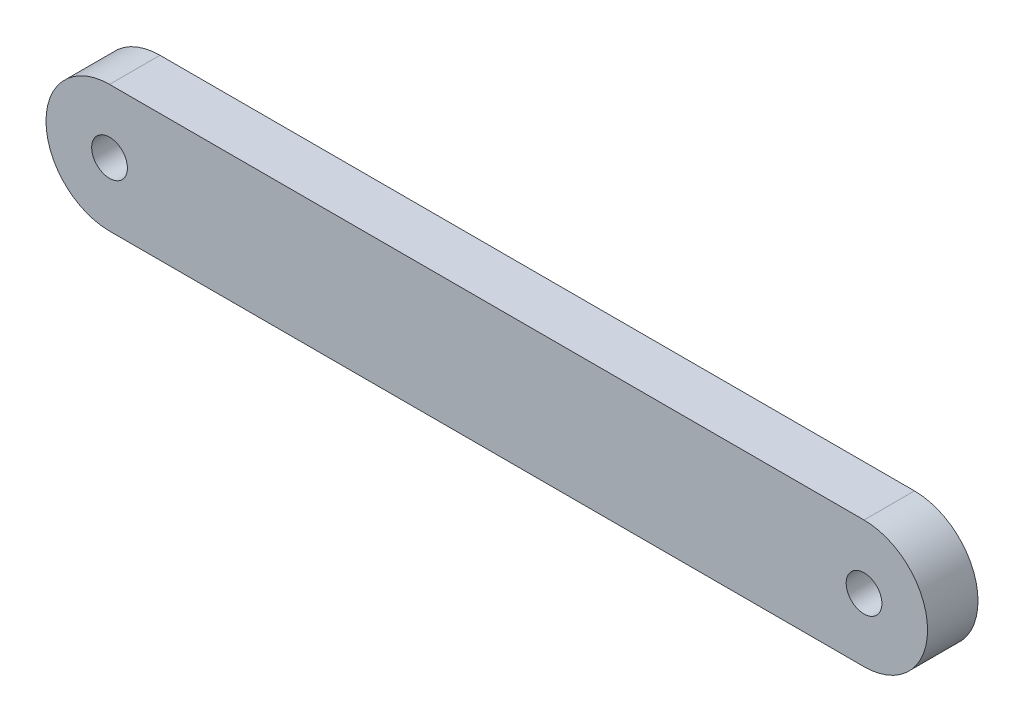
ISO-10303-21;
HEADER;
FILE_DESCRIPTION(('STEP AP214'),'2;1');
FILE_NAME('part.step','',(''),(''),'','','');
FILE_SCHEMA(('AUTOMOTIVE_DESIGN { 1 0 10303 214 1 1 1 1 }'));
ENDSEC;
DATA;
#1=APPLICATION_CONTEXT('core data for automotive mechanical design processes');
#2=APPLICATION_PROTOCOL_DEFINITION('international standard','automotive_design',2000,#1);
#3=PRODUCT_CONTEXT('',#1,'mechanical');
#4=PRODUCT('Part','Part','',(#3));
#5=PRODUCT_RELATED_PRODUCT_CATEGORY('part','',(#4));
#6=PRODUCT_DEFINITION_FORMATION('','',#4);
#7=PRODUCT_DEFINITION_CONTEXT('part definition',#1,'design');
#8=PRODUCT_DEFINITION('design','',#6,#7);
#9=PRODUCT_DEFINITION_SHAPE('','',#8);
#10=(LENGTH_UNIT() NAMED_UNIT(*) SI_UNIT(.MILLI.,.METRE.));
#11=(NAMED_UNIT(*) PLANE_ANGLE_UNIT() SI_UNIT($,.RADIAN.));
#12=(NAMED_UNIT(*) SI_UNIT($,.STERADIAN.) SOLID_ANGLE_UNIT());
#13=UNCERTAINTY_MEASURE_WITH_UNIT(LENGTH_MEASURE(1.E-05),#10,'distance_accuracy_value','');
#14=(GEOMETRIC_REPRESENTATION_CONTEXT(3) GLOBAL_UNCERTAINTY_ASSIGNED_CONTEXT((#13)) GLOBAL_UNIT_ASSIGNED_CONTEXT((#10,
#11,#12)) REPRESENTATION_CONTEXT('',''));
#15=CARTESIAN_POINT('',(0.,0.,0.));
#16=DIRECTION('',(0.,0.,1.));
#17=DIRECTION('',(1.,0.,0.));
#18=AXIS2_PLACEMENT_3D('',#15,#16,#17);
#19=CARTESIAN_POINT('',(47.5,0.,77.605));
#20=DIRECTION('',(0.,0.,-1.));
#21=DIRECTION('',(-1.,0.,0.));
#22=AXIS2_PLACEMENT_3D('',#19,#20,#21);
#23=PLANE('',#22);
#24=CARTESIAN_POINT('',(47.5,0.,77.605));
#25=DIRECTION('',(0.,0.,-1.));
#26=DIRECTION('',(-1.,0.,0.));
#27=AXIS2_PLACEMENT_3D('',#24,#25,#26);
#28=CIRCLE('',#27,2.25);
#29=CARTESIAN_POINT('',(45.25,0.,77.605));
#30=VERTEX_POINT('',#29);
#31=EDGE_CURVE('E100',#30,#30,#28,.T.);
#32=ORIENTED_EDGE('',*,*,#31,.F.);
#33=EDGE_LOOP('',(#32));
#34=FACE_BOUND('',#33,.T.);
#35=CARTESIAN_POINT('',(47.5,0.,77.605));
#36=DIRECTION('',(0.,0.,-1.));
#37=DIRECTION('',(-1.,0.,0.));
#38=AXIS2_PLACEMENT_3D('',#35,#36,#37);
#39=CIRCLE('',#38,8.);
#40=CARTESIAN_POINT('',(47.5,8.,77.605));
#41=VERTEX_POINT('',#40);
#42=CARTESIAN_POINT('',(47.5,-8.,77.605));
#43=VERTEX_POINT('',#42);
#44=EDGE_CURVE('E85',#41,#43,#39,.T.);
#45=ORIENTED_EDGE('',*,*,#44,.T.);
#46=DIRECTION('',(-1.,0.,0.));
#47=VECTOR('',#46,1.);
#48=CARTESIAN_POINT('',(47.5,-8.,77.605));
#49=LINE('',#48,#47);
#50=CARTESIAN_POINT('',(-47.5,-7.99999999999998,77.605));
#51=VERTEX_POINT('',#50);
#52=EDGE_CURVE('E80',#43,#51,#49,.T.);
#53=ORIENTED_EDGE('',*,*,#52,.T.);
#54=CARTESIAN_POINT('',(-47.5,0.,77.605));
#55=DIRECTION('',(0.,0.,-1.));
#56=DIRECTION('',(-1.,0.,0.));
#57=AXIS2_PLACEMENT_3D('',#54,#55,#56);
#58=CIRCLE('',#57,8.);
#59=CARTESIAN_POINT('',(-47.5,8.00000000000003,77.605));
#60=VERTEX_POINT('',#59);
#61=EDGE_CURVE('E83',#51,#60,#58,.T.);
#62=ORIENTED_EDGE('',*,*,#61,.T.);
#63=DIRECTION('',(1.,0.,0.));
#64=VECTOR('',#63,1.);
#65=CARTESIAN_POINT('',(47.5,8.,77.605));
#66=LINE('',#65,#64);
#67=EDGE_CURVE('E50',#60,#41,#66,.T.);
#68=ORIENTED_EDGE('',*,*,#67,.T.);
#69=EDGE_LOOP('',(#45,#53,#62,#68));
#70=FACE_BOUND('',#69,.T.);
#71=CARTESIAN_POINT('',(-47.5,0.,77.605));
#72=DIRECTION('',(0.,0.,-1.));
#73=DIRECTION('',(-1.,0.,0.));
#74=AXIS2_PLACEMENT_3D('',#71,#72,#73);
#75=CIRCLE('',#74,2.25);
#76=CARTESIAN_POINT('',(-49.75,0.,77.605));
#77=VERTEX_POINT('',#76);
#78=EDGE_CURVE('E115',#77,#77,#75,.T.);
#79=ORIENTED_EDGE('',*,*,#78,.F.);
#80=EDGE_LOOP('',(#79));
#81=FACE_BOUND('',#80,.T.);
#82=ADVANCED_FACE('F33',(#34,#70,#81),#23,.T.);
#83=CARTESIAN_POINT('',(47.5,0.,83.955));
#84=DIRECTION('',(0.,0.,-1.));
#85=DIRECTION('',(-1.,0.,0.));
#86=AXIS2_PLACEMENT_3D('',#83,#84,#85);
#87=PLANE('',#86);
#88=CARTESIAN_POINT('',(47.5,0.,83.955));
#89=DIRECTION('',(0.,0.,-1.));
#90=DIRECTION('',(-1.,0.,0.));
#91=AXIS2_PLACEMENT_3D('',#88,#89,#90);
#92=CIRCLE('',#91,8.);
#93=CARTESIAN_POINT('',(47.5,8.,83.955));
#94=VERTEX_POINT('',#93);
#95=CARTESIAN_POINT('',(47.5,-8.,83.955));
#96=VERTEX_POINT('',#95);
#97=EDGE_CURVE('E97',#94,#96,#92,.T.);
#98=ORIENTED_EDGE('',*,*,#97,.F.);
#99=DIRECTION('',(1.,0.,0.));
#100=VECTOR('',#99,1.);
#101=CARTESIAN_POINT('',(47.5,8.,83.955));
#102=LINE('',#101,#100);
#103=CARTESIAN_POINT('',(-47.5,8.00000000000003,83.955));
#104=VERTEX_POINT('',#103);
#105=EDGE_CURVE('E73',#104,#94,#102,.T.);
#106=ORIENTED_EDGE('',*,*,#105,.F.);
#107=CARTESIAN_POINT('',(-47.5,0.,83.955));
#108=DIRECTION('',(0.,0.,-1.));
#109=DIRECTION('',(-1.,0.,0.));
#110=AXIS2_PLACEMENT_3D('',#107,#108,#109);
#111=CIRCLE('',#110,8.);
#112=CARTESIAN_POINT('',(-47.5,-7.99999999999998,83.955));
#113=VERTEX_POINT('',#112);
#114=EDGE_CURVE('E67',#113,#104,#111,.T.);
#115=ORIENTED_EDGE('',*,*,#114,.F.);
#116=DIRECTION('',(-1.,0.,0.));
#117=VECTOR('',#116,1.);
#118=CARTESIAN_POINT('',(47.5,-8.,83.955));
#119=LINE('',#118,#117);
#120=EDGE_CURVE('E89',#96,#113,#119,.T.);
#121=ORIENTED_EDGE('',*,*,#120,.F.);
#122=EDGE_LOOP('',(#98,#106,#115,#121));
#123=FACE_BOUND('',#122,.T.);
#124=CARTESIAN_POINT('',(47.5,0.,83.955));
#125=DIRECTION('',(0.,0.,-1.));
#126=DIRECTION('',(-1.,0.,0.));
#127=AXIS2_PLACEMENT_3D('',#124,#125,#126);
#128=CIRCLE('',#127,2.25);
#129=CARTESIAN_POINT('',(45.25,0.,83.955));
#130=VERTEX_POINT('',#129);
#131=EDGE_CURVE('E112',#130,#130,#128,.T.);
#132=ORIENTED_EDGE('',*,*,#131,.T.);
#133=EDGE_LOOP('',(#132));
#134=FACE_BOUND('',#133,.T.);
#135=CARTESIAN_POINT('',(-47.5,0.,83.955));
#136=DIRECTION('',(0.,0.,-1.));
#137=DIRECTION('',(-1.,0.,0.));
#138=AXIS2_PLACEMENT_3D('',#135,#136,#137);
#139=CIRCLE('',#138,2.25);
#140=CARTESIAN_POINT('',(-49.75,0.,83.955));
#141=VERTEX_POINT('',#140);
#142=EDGE_CURVE('E118',#141,#141,#139,.T.);
#143=ORIENTED_EDGE('',*,*,#142,.T.);
#144=EDGE_LOOP('',(#143));
#145=FACE_BOUND('',#144,.T.);
#146=ADVANCED_FACE('F108',(#123,#134,#145),#87,.F.);
#147=CARTESIAN_POINT('',(47.5,0.,77.605));
#148=DIRECTION('',(0.,0.,1.));
#149=DIRECTION('',(1.,0.,0.));
#150=AXIS2_PLACEMENT_3D('',#147,#148,#149);
#151=CYLINDRICAL_SURFACE('',#150,8.);
#152=ORIENTED_EDGE('',*,*,#97,.T.);
#153=DIRECTION('',(0.,0.,1.));
#154=VECTOR('',#153,1.);
#155=CARTESIAN_POINT('',(47.5,-8.,77.605));
#156=LINE('',#155,#154);
#157=EDGE_CURVE('E11',#43,#96,#156,.T.);
#158=ORIENTED_EDGE('',*,*,#157,.F.);
#159=ORIENTED_EDGE('',*,*,#44,.F.);
#160=DIRECTION('',(0.,0.,1.));
#161=VECTOR('',#160,1.);
#162=CARTESIAN_POINT('',(47.5,8.,77.605));
#163=LINE('',#162,#161);
#164=EDGE_CURVE('E93',#41,#94,#163,.T.);
#165=ORIENTED_EDGE('',*,*,#164,.T.);
#166=EDGE_LOOP('',(#152,#158,#159,#165));
#167=FACE_BOUND('',#166,.T.);
#168=ADVANCED_FACE('F35',(#167),#151,.T.);
#169=CARTESIAN_POINT('',(47.5,-8.,77.605));
#170=DIRECTION('',(0.,1.,0.));
#171=DIRECTION('',(-1.,0.,0.));
#172=AXIS2_PLACEMENT_3D('',#169,#170,#171);
#173=PLANE('',#172);
#174=ORIENTED_EDGE('',*,*,#120,.T.);
#175=DIRECTION('',(0.,0.,1.));
#176=VECTOR('',#175,1.);
#177=CARTESIAN_POINT('',(-47.5,-7.99999999999998,77.605));
#178=LINE('',#177,#176);
#179=EDGE_CURVE('E42',#51,#113,#178,.T.);
#180=ORIENTED_EDGE('',*,*,#179,.F.);
#181=ORIENTED_EDGE('',*,*,#52,.F.);
#182=ORIENTED_EDGE('',*,*,#157,.T.);
#183=EDGE_LOOP('',(#174,#180,#181,#182));
#184=FACE_BOUND('',#183,.T.);
#185=ADVANCED_FACE('F88',(#184),#173,.F.);
#186=CARTESIAN_POINT('',(-47.5,0.,77.605));
#187=DIRECTION('',(0.,0.,1.));
#188=DIRECTION('',(1.,0.,0.));
#189=AXIS2_PLACEMENT_3D('',#186,#187,#188);
#190=CYLINDRICAL_SURFACE('',#189,8.);
#191=ORIENTED_EDGE('',*,*,#114,.T.);
#192=DIRECTION('',(0.,0.,1.));
#193=VECTOR('',#192,1.);
#194=CARTESIAN_POINT('',(-47.5,8.00000000000003,77.605));
#195=LINE('',#194,#193);
#196=EDGE_CURVE('E90',#60,#104,#195,.T.);
#197=ORIENTED_EDGE('',*,*,#196,.F.);
#198=ORIENTED_EDGE('',*,*,#61,.F.);
#199=ORIENTED_EDGE('',*,*,#179,.T.);
#200=EDGE_LOOP('',(#191,#197,#198,#199));
#201=FACE_BOUND('',#200,.T.);
#202=ADVANCED_FACE('F91',(#201),#190,.T.);
#203=CARTESIAN_POINT('',(47.5,8.,77.605));
#204=DIRECTION('',(0.,-1.,0.));
#205=DIRECTION('',(1.,0.,0.));
#206=AXIS2_PLACEMENT_3D('',#203,#204,#205);
#207=PLANE('',#206);
#208=ORIENTED_EDGE('',*,*,#105,.T.);
#209=ORIENTED_EDGE('',*,*,#164,.F.);
#210=ORIENTED_EDGE('',*,*,#67,.F.);
#211=ORIENTED_EDGE('',*,*,#196,.T.);
#212=EDGE_LOOP('',(#208,#209,#210,#211));
#213=FACE_BOUND('',#212,.T.);
#214=ADVANCED_FACE('F105',(#213),#207,.F.);
#215=CARTESIAN_POINT('',(47.5,0.,77.605));
#216=DIRECTION('',(0.,0.,1.));
#217=DIRECTION('',(1.,0.,0.));
#218=AXIS2_PLACEMENT_3D('',#215,#216,#217);
#219=CYLINDRICAL_SURFACE('',#218,2.25);
#220=ORIENTED_EDGE('',*,*,#31,.T.);
#221=EDGE_LOOP('',(#220));
#222=FACE_BOUND('',#221,.T.);
#223=ORIENTED_EDGE('',*,*,#131,.F.);
#224=EDGE_LOOP('',(#223));
#225=FACE_BOUND('',#224,.T.);
#226=ADVANCED_FACE('F135',(#222,#225),#219,.F.);
#227=CARTESIAN_POINT('',(-47.5,0.,77.605));
#228=DIRECTION('',(0.,0.,1.));
#229=DIRECTION('',(1.,0.,0.));
#230=AXIS2_PLACEMENT_3D('',#227,#228,#229);
#231=CYLINDRICAL_SURFACE('',#230,2.25);
#232=ORIENTED_EDGE('',*,*,#78,.T.);
#233=EDGE_LOOP('',(#232));
#234=FACE_BOUND('',#233,.T.);
#235=ORIENTED_EDGE('',*,*,#142,.F.);
#236=EDGE_LOOP('',(#235));
#237=FACE_BOUND('',#236,.T.);
#238=ADVANCED_FACE('F124',(#234,#237),#231,.F.);
#239=CLOSED_SHELL('',(#82,#146,#168,#185,#202,#214,#226,#238));
#240=MANIFOLD_SOLID_BREP('B2',#239);
#241=ADVANCED_BREP_SHAPE_REPRESENTATION('',(#18,#240),#14);
#242=SHAPE_DEFINITION_REPRESENTATION(#9,#241);
ENDSEC;
END-ISO-10303-21;
